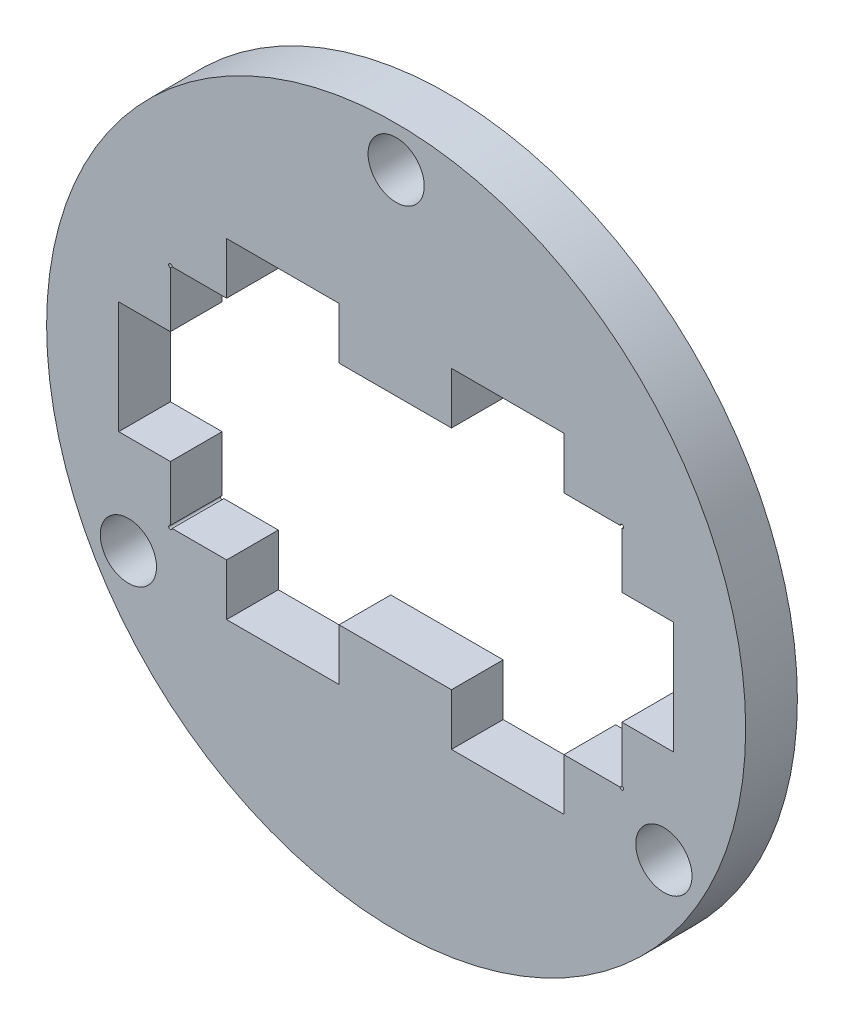
ISO-10303-21;
HEADER;
FILE_DESCRIPTION(('STEP AP214'),'2;1');
FILE_NAME('part.step','',(''),(''),'','','');
FILE_SCHEMA(('AUTOMOTIVE_DESIGN { 1 0 10303 214 1 1 1 1 }'));
ENDSEC;
DATA;
#1=APPLICATION_CONTEXT('core data for automotive mechanical design processes');
#2=APPLICATION_PROTOCOL_DEFINITION('international standard','automotive_design',2000,#1);
#3=PRODUCT_CONTEXT('',#1,'mechanical');
#4=PRODUCT('Part','Part','',(#3));
#5=PRODUCT_RELATED_PRODUCT_CATEGORY('part','',(#4));
#6=PRODUCT_DEFINITION_FORMATION('','',#4);
#7=PRODUCT_DEFINITION_CONTEXT('part definition',#1,'design');
#8=PRODUCT_DEFINITION('design','',#6,#7);
#9=PRODUCT_DEFINITION_SHAPE('','',#8);
#10=(LENGTH_UNIT() NAMED_UNIT(*) SI_UNIT(.MILLI.,.METRE.));
#11=(NAMED_UNIT(*) PLANE_ANGLE_UNIT() SI_UNIT($,.RADIAN.));
#12=(NAMED_UNIT(*) SI_UNIT($,.STERADIAN.) SOLID_ANGLE_UNIT());
#13=UNCERTAINTY_MEASURE_WITH_UNIT(LENGTH_MEASURE(1.E-05),#10,'distance_accuracy_value','');
#14=(GEOMETRIC_REPRESENTATION_CONTEXT(3) GLOBAL_UNCERTAINTY_ASSIGNED_CONTEXT((#13)) GLOBAL_UNIT_ASSIGNED_CONTEXT((#10,
#11,#12)) REPRESENTATION_CONTEXT('',''));
#15=CARTESIAN_POINT('',(0.,0.,0.));
#16=DIRECTION('',(0.,0.,1.));
#17=DIRECTION('',(1.,0.,0.));
#18=AXIS2_PLACEMENT_3D('',#15,#16,#17);
#19=CARTESIAN_POINT('',(-25.5,0.,5.842));
#20=DIRECTION('',(-1.,0.,0.));
#21=DIRECTION('',(0.,0.,1.));
#22=AXIS2_PLACEMENT_3D('',#19,#20,#21);
#23=PLANE('',#22);
#24=DIRECTION('',(0.,1.,0.));
#25=VECTOR('',#24,1.);
#26=CARTESIAN_POINT('',(-25.5,0.,0.));
#27=LINE('',#26,#25);
#28=CARTESIAN_POINT('',(-25.5,-12.6015625,0.));
#29=VERTEX_POINT('',#28);
#30=CARTESIAN_POINT('',(-25.5,-6.34999999999999,0.));
#31=VERTEX_POINT('',#30);
#32=EDGE_CURVE('E456',#29,#31,#27,.T.);
#33=ORIENTED_EDGE('',*,*,#32,.T.);
#34=DIRECTION('',(0.,0.,-1.));
#35=VECTOR('',#34,1.);
#36=CARTESIAN_POINT('',(-25.5,-6.34999999999999,5.842));
#37=LINE('',#36,#35);
#38=CARTESIAN_POINT('',(-25.5,-6.34999999999999,5.842));
#39=VERTEX_POINT('',#38);
#40=EDGE_CURVE('E276',#39,#31,#37,.T.);
#41=ORIENTED_EDGE('',*,*,#40,.F.);
#42=DIRECTION('',(0.,1.,0.));
#43=VECTOR('',#42,1.);
#44=CARTESIAN_POINT('',(-25.5,0.,5.842));
#45=LINE('',#44,#43);
#46=CARTESIAN_POINT('',(-25.5,-12.6015625,5.842));
#47=VERTEX_POINT('',#46);
#48=EDGE_CURVE('E418',#47,#39,#45,.T.);
#49=ORIENTED_EDGE('',*,*,#48,.F.);
#50=DIRECTION('',(0.,0.,-1.));
#51=VECTOR('',#50,1.);
#52=CARTESIAN_POINT('',(-25.5,-12.6015625,5.842));
#53=LINE('',#52,#51);
#54=EDGE_CURVE('E11',#47,#29,#53,.T.);
#55=ORIENTED_EDGE('',*,*,#54,.T.);
#56=EDGE_LOOP('',(#33,#41,#49,#55));
#57=FACE_BOUND('',#56,.T.);
#58=ADVANCED_FACE('F37',(#57),#23,.F.);
#59=CARTESIAN_POINT('',(25.5,0.,5.842));
#60=DIRECTION('',(-1.,0.,0.));
#61=DIRECTION('',(0.,0.,1.));
#62=AXIS2_PLACEMENT_3D('',#59,#60,#61);
#63=PLANE('',#62);
#64=DIRECTION('',(0.,0.,-1.));
#65=VECTOR('',#64,1.);
#66=CARTESIAN_POINT('',(25.5,-6.35,5.842));
#67=LINE('',#66,#65);
#68=CARTESIAN_POINT('',(25.5,-6.35,5.842));
#69=VERTEX_POINT('',#68);
#70=CARTESIAN_POINT('',(25.5,-6.35,0.));
#71=VERTEX_POINT('',#70);
#72=EDGE_CURVE('E294',#69,#71,#67,.T.);
#73=ORIENTED_EDGE('',*,*,#72,.T.);
#74=DIRECTION('',(0.,1.,0.));
#75=VECTOR('',#74,1.);
#76=CARTESIAN_POINT('',(25.5,0.,0.));
#77=LINE('',#76,#75);
#78=CARTESIAN_POINT('',(25.5,-12.6015625,0.));
#79=VERTEX_POINT('',#78);
#80=EDGE_CURVE('E471',#79,#71,#77,.T.);
#81=ORIENTED_EDGE('',*,*,#80,.F.);
#82=DIRECTION('',(0.,0.,-1.));
#83=VECTOR('',#82,1.);
#84=CARTESIAN_POINT('',(25.5,-12.6015625,5.842));
#85=LINE('',#84,#83);
#86=CARTESIAN_POINT('',(25.5,-12.6015625,5.842));
#87=VERTEX_POINT('',#86);
#88=EDGE_CURVE('E494',#87,#79,#85,.T.);
#89=ORIENTED_EDGE('',*,*,#88,.F.);
#90=DIRECTION('',(0.,1.,0.));
#91=VECTOR('',#90,1.);
#92=CARTESIAN_POINT('',(25.5,0.,5.842));
#93=LINE('',#92,#91);
#94=EDGE_CURVE('E432',#87,#69,#93,.T.);
#95=ORIENTED_EDGE('',*,*,#94,.T.);
#96=EDGE_LOOP('',(#73,#81,#89,#95));
#97=FACE_BOUND('',#96,.T.);
#98=ADVANCED_FACE('F531',(#97),#63,.T.);
#99=CARTESIAN_POINT('',(0.,-12.8,5.842));
#100=DIRECTION('',(0.,1.,0.));
#101=DIRECTION('',(0.,0.,1.));
#102=AXIS2_PLACEMENT_3D('',#99,#100,#101);
#103=PLANE('',#102);
#104=DIRECTION('',(0.,0.,-1.));
#105=VECTOR('',#104,1.);
#106=CARTESIAN_POINT('',(18.9499969420604,-12.8,5.842));
#107=LINE('',#106,#105);
#108=CARTESIAN_POINT('',(18.9499969420604,-12.8,5.842));
#109=VERTEX_POINT('',#108);
#110=CARTESIAN_POINT('',(18.9499969420604,-12.8,0.));
#111=VERTEX_POINT('',#110);
#112=EDGE_CURVE('E320',#109,#111,#107,.T.);
#113=ORIENTED_EDGE('',*,*,#112,.F.);
#114=DIRECTION('',(1.,0.,0.));
#115=VECTOR('',#114,1.);
#116=CARTESIAN_POINT('',(0.,-12.8,5.842));
#117=LINE('',#116,#115);
#118=CARTESIAN_POINT('',(25.3015625,-12.8,5.842));
#119=VERTEX_POINT('',#118);
#120=EDGE_CURVE('E438',#109,#119,#117,.T.);
#121=ORIENTED_EDGE('',*,*,#120,.T.);
#122=DIRECTION('',(0.,0.,-1.));
#123=VECTOR('',#122,1.);
#124=CARTESIAN_POINT('',(25.3015625,-12.8,5.842));
#125=LINE('',#124,#123);
#126=CARTESIAN_POINT('',(25.3015625,-12.8,0.));
#127=VERTEX_POINT('',#126);
#128=EDGE_CURVE('E491',#119,#127,#125,.T.);
#129=ORIENTED_EDGE('',*,*,#128,.T.);
#130=DIRECTION('',(1.,0.,0.));
#131=VECTOR('',#130,1.);
#132=CARTESIAN_POINT('',(0.,-12.8,0.));
#133=LINE('',#132,#131);
#134=EDGE_CURVE('E477',#111,#127,#133,.T.);
#135=ORIENTED_EDGE('',*,*,#134,.F.);
#136=EDGE_LOOP('',(#113,#121,#129,#135));
#137=FACE_BOUND('',#136,.T.);
#138=ADVANCED_FACE('F536',(#137),#103,.T.);
#139=CARTESIAN_POINT('',(0.,12.8,5.842));
#140=DIRECTION('',(0.,1.,0.));
#141=DIRECTION('',(0.,0.,1.));
#142=AXIS2_PLACEMENT_3D('',#139,#140,#141);
#143=PLANE('',#142);
#144=DIRECTION('',(1.,0.,0.));
#145=VECTOR('',#144,1.);
#146=CARTESIAN_POINT('',(0.,12.8,0.));
#147=LINE('',#146,#145);
#148=CARTESIAN_POINT('',(-6.45000305793958,12.8,0.));
#149=VERTEX_POINT('',#148);
#150=CARTESIAN_POINT('',(6.24999694206041,12.8,0.));
#151=VERTEX_POINT('',#150);
#152=EDGE_CURVE('E467',#149,#151,#147,.T.);
#153=ORIENTED_EDGE('',*,*,#152,.T.);
#154=DIRECTION('',(0.,0.,-1.));
#155=VECTOR('',#154,1.);
#156=CARTESIAN_POINT('',(6.24999694206041,12.8,5.842));
#157=LINE('',#156,#155);
#158=CARTESIAN_POINT('',(6.24999694206041,12.8,5.842));
#159=VERTEX_POINT('',#158);
#160=EDGE_CURVE('E346',#159,#151,#157,.T.);
#161=ORIENTED_EDGE('',*,*,#160,.F.);
#162=DIRECTION('',(1.,0.,0.));
#163=VECTOR('',#162,1.);
#164=CARTESIAN_POINT('',(0.,12.8,5.842));
#165=LINE('',#164,#163);
#166=CARTESIAN_POINT('',(-6.45000305793958,12.8,5.842));
#167=VERTEX_POINT('',#166);
#168=EDGE_CURVE('E428',#167,#159,#165,.T.);
#169=ORIENTED_EDGE('',*,*,#168,.F.);
#170=DIRECTION('',(0.,0.,-1.));
#171=VECTOR('',#170,1.);
#172=CARTESIAN_POINT('',(-6.45000305793958,12.8,5.842));
#173=LINE('',#172,#171);
#174=EDGE_CURVE('E401',#167,#149,#173,.T.);
#175=ORIENTED_EDGE('',*,*,#174,.T.);
#176=EDGE_LOOP('',(#153,#161,#169,#175));
#177=FACE_BOUND('',#176,.T.);
#178=ADVANCED_FACE('F609',(#177),#143,.F.);
#179=DIRECTION('',(0.,0.,-1.));
#180=VECTOR('',#179,1.);
#181=CARTESIAN_POINT('',(-19.1500030579396,-12.8,5.842));
#182=LINE('',#181,#180);
#183=CARTESIAN_POINT('',(-19.1500030579396,-12.8,5.842));
#184=VERTEX_POINT('',#183);
#185=CARTESIAN_POINT('',(-19.1500030579396,-12.8,0.));
#186=VERTEX_POINT('',#185);
#187=EDGE_CURVE('E365',#184,#186,#182,.T.);
#188=ORIENTED_EDGE('',*,*,#187,.T.);
#189=CARTESIAN_POINT('',(-25.3015625,-12.8,0.));
#190=VERTEX_POINT('',#189);
#191=EDGE_CURVE('E478',#190,#186,#133,.T.);
#192=ORIENTED_EDGE('',*,*,#191,.F.);
#193=DIRECTION('',(0.,0.,-1.));
#194=VECTOR('',#193,1.);
#195=CARTESIAN_POINT('',(-25.3015625,-12.8,5.842));
#196=LINE('',#195,#194);
#197=CARTESIAN_POINT('',(-25.3015625,-12.8,5.842));
#198=VERTEX_POINT('',#197);
#199=EDGE_CURVE('E452',#198,#190,#196,.T.);
#200=ORIENTED_EDGE('',*,*,#199,.F.);
#201=EDGE_CURVE('E439',#198,#184,#117,.T.);
#202=ORIENTED_EDGE('',*,*,#201,.T.);
#203=EDGE_LOOP('',(#188,#192,#200,#202));
#204=FACE_BOUND('',#203,.T.);
#205=ADVANCED_FACE('F549',(#204),#103,.T.);
#206=CARTESIAN_POINT('',(-25.3015625,12.8,0.));
#207=VERTEX_POINT('',#206);
#208=CARTESIAN_POINT('',(-19.1500030579396,12.8,0.));
#209=VERTEX_POINT('',#208);
#210=EDGE_CURVE('E463',#207,#209,#147,.T.);
#211=ORIENTED_EDGE('',*,*,#210,.T.);
#212=DIRECTION('',(0.,0.,-1.));
#213=VECTOR('',#212,1.);
#214=CARTESIAN_POINT('',(-19.1500030579396,12.8,5.842));
#215=LINE('',#214,#213);
#216=CARTESIAN_POINT('',(-19.1500030579396,12.8,5.842));
#217=VERTEX_POINT('',#216);
#218=EDGE_CURVE('E398',#217,#209,#215,.T.);
#219=ORIENTED_EDGE('',*,*,#218,.F.);
#220=CARTESIAN_POINT('',(-25.3015625,12.8,5.842));
#221=VERTEX_POINT('',#220);
#222=EDGE_CURVE('E424',#221,#217,#165,.T.);
#223=ORIENTED_EDGE('',*,*,#222,.F.);
#224=DIRECTION('',(0.,0.,-1.));
#225=VECTOR('',#224,1.);
#226=CARTESIAN_POINT('',(-25.3015625,12.8,5.842));
#227=LINE('',#226,#225);
#228=EDGE_CURVE('E502',#221,#207,#227,.T.);
#229=ORIENTED_EDGE('',*,*,#228,.T.);
#230=EDGE_LOOP('',(#211,#219,#223,#229));
#231=FACE_BOUND('',#230,.T.);
#232=ADVANCED_FACE('F519',(#231),#143,.F.);
#233=CARTESIAN_POINT('',(0.,0.,5.842));
#234=DIRECTION('',(0.,0.,1.));
#235=DIRECTION('',(1.,0.,0.));
#236=AXIS2_PLACEMENT_3D('',#233,#234,#235);
#237=PLANE('',#236);
#238=DIRECTION('',(-1.,0.,0.));
#239=VECTOR('',#238,1.);
#240=CARTESIAN_POINT('',(-31.342,-6.34999999999999,5.842));
#241=LINE('',#240,#239);
#242=CARTESIAN_POINT('',(-31.342,-6.34999999999999,5.842));
#243=VERTEX_POINT('',#242);
#244=EDGE_CURVE('E254',#39,#243,#241,.T.);
#245=ORIENTED_EDGE('',*,*,#244,.T.);
#246=DIRECTION('',(0.,1.,0.));
#247=VECTOR('',#246,1.);
#248=CARTESIAN_POINT('',(-31.342,-6.34999999999999,5.842));
#249=LINE('',#248,#247);
#250=CARTESIAN_POINT('',(-31.342,6.35,5.842));
#251=VERTEX_POINT('',#250);
#252=EDGE_CURVE('E249',#243,#251,#249,.T.);
#253=ORIENTED_EDGE('',*,*,#252,.T.);
#254=DIRECTION('',(1.,0.,0.));
#255=VECTOR('',#254,1.);
#256=CARTESIAN_POINT('',(-31.342,6.35,5.842));
#257=LINE('',#256,#255);
#258=CARTESIAN_POINT('',(-25.5,6.35,5.842));
#259=VERTEX_POINT('',#258);
#260=EDGE_CURVE('E257',#251,#259,#257,.T.);
#261=ORIENTED_EDGE('',*,*,#260,.T.);
#262=CARTESIAN_POINT('',(-25.5,12.6015625,5.842));
#263=VERTEX_POINT('',#262);
#264=EDGE_CURVE('E416',#259,#263,#45,.T.);
#265=ORIENTED_EDGE('',*,*,#264,.T.);
#266=CARTESIAN_POINT('',(-25.5,12.8,5.842));
#267=DIRECTION('',(0.,0.,1.));
#268=DIRECTION('',(1.,0.,0.));
#269=AXIS2_PLACEMENT_3D('',#266,#267,#268);
#270=CIRCLE('',#269,0.198437499999999);
#271=EDGE_CURVE('E420',#221,#263,#270,.T.);
#272=ORIENTED_EDGE('',*,*,#271,.F.);
#273=ORIENTED_EDGE('',*,*,#222,.T.);
#274=DIRECTION('',(0.,1.,0.));
#275=VECTOR('',#274,1.);
#276=CARTESIAN_POINT('',(-19.1500030579396,12.8,5.842));
#277=LINE('',#276,#275);
#278=CARTESIAN_POINT('',(-19.1500030579396,18.642,5.842));
#279=VERTEX_POINT('',#278);
#280=EDGE_CURVE('E381',#217,#279,#277,.T.);
#281=ORIENTED_EDGE('',*,*,#280,.T.);
#282=DIRECTION('',(1.,0.,0.));
#283=VECTOR('',#282,1.);
#284=CARTESIAN_POINT('',(-19.1500030579396,18.642,5.842));
#285=LINE('',#284,#283);
#286=CARTESIAN_POINT('',(-6.45000305793958,18.642,5.842));
#287=VERTEX_POINT('',#286);
#288=EDGE_CURVE('E384',#279,#287,#285,.T.);
#289=ORIENTED_EDGE('',*,*,#288,.T.);
#290=DIRECTION('',(0.,-1.,0.));
#291=VECTOR('',#290,1.);
#292=CARTESIAN_POINT('',(-6.45000305793958,12.8,5.842));
#293=LINE('',#292,#291);
#294=EDGE_CURVE('E388',#287,#167,#293,.T.);
#295=ORIENTED_EDGE('',*,*,#294,.T.);
#296=ORIENTED_EDGE('',*,*,#168,.T.);
#297=DIRECTION('',(0.,1.,0.));
#298=VECTOR('',#297,1.);
#299=CARTESIAN_POINT('',(6.24999694206041,12.8,5.842));
#300=LINE('',#299,#298);
#301=CARTESIAN_POINT('',(6.24999694206041,18.642,5.842));
#302=VERTEX_POINT('',#301);
#303=EDGE_CURVE('E329',#159,#302,#300,.T.);
#304=ORIENTED_EDGE('',*,*,#303,.T.);
#305=DIRECTION('',(1.,0.,0.));
#306=VECTOR('',#305,1.);
#307=CARTESIAN_POINT('',(18.9499969420604,18.642,5.842));
#308=LINE('',#307,#306);
#309=CARTESIAN_POINT('',(18.9499969420604,18.642,5.842));
#310=VERTEX_POINT('',#309);
#311=EDGE_CURVE('E332',#302,#310,#308,.T.);
#312=ORIENTED_EDGE('',*,*,#311,.T.);
#313=DIRECTION('',(0.,-1.,0.));
#314=VECTOR('',#313,1.);
#315=CARTESIAN_POINT('',(18.9499969420604,12.8,5.842));
#316=LINE('',#315,#314);
#317=CARTESIAN_POINT('',(18.9499969420604,12.8,5.842));
#318=VERTEX_POINT('',#317);
#319=EDGE_CURVE('E336',#310,#318,#316,.T.);
#320=ORIENTED_EDGE('',*,*,#319,.T.);
#321=CARTESIAN_POINT('',(25.3015625,12.8,5.842));
#322=VERTEX_POINT('',#321);
#323=EDGE_CURVE('E423',#318,#322,#165,.T.);
#324=ORIENTED_EDGE('',*,*,#323,.T.);
#325=CARTESIAN_POINT('',(25.5,12.8,5.842));
#326=DIRECTION('',(0.,0.,1.));
#327=DIRECTION('',(1.,0.,0.));
#328=AXIS2_PLACEMENT_3D('',#325,#326,#327);
#329=CIRCLE('',#328,0.198437499999999);
#330=CARTESIAN_POINT('',(25.5,12.6015625,5.842));
#331=VERTEX_POINT('',#330);
#332=EDGE_CURVE('E427',#331,#322,#329,.T.);
#333=ORIENTED_EDGE('',*,*,#332,.F.);
#334=CARTESIAN_POINT('',(25.5,6.35,5.842));
#335=VERTEX_POINT('',#334);
#336=EDGE_CURVE('E431',#335,#331,#93,.T.);
#337=ORIENTED_EDGE('',*,*,#336,.F.);
#338=DIRECTION('',(1.,0.,0.));
#339=VECTOR('',#338,1.);
#340=CARTESIAN_POINT('',(31.342,6.35,5.842));
#341=LINE('',#340,#339);
#342=CARTESIAN_POINT('',(31.342,6.35,5.842));
#343=VERTEX_POINT('',#342);
#344=EDGE_CURVE('E60',#335,#343,#341,.T.);
#345=ORIENTED_EDGE('',*,*,#344,.T.);
#346=DIRECTION('',(0.,-1.,0.));
#347=VECTOR('',#346,1.);
#348=CARTESIAN_POINT('',(31.342,-6.35,5.842));
#349=LINE('',#348,#347);
#350=CARTESIAN_POINT('',(31.342,-6.35,5.842));
#351=VERTEX_POINT('',#350);
#352=EDGE_CURVE('E280',#343,#351,#349,.T.);
#353=ORIENTED_EDGE('',*,*,#352,.T.);
#354=DIRECTION('',(-1.,0.,0.));
#355=VECTOR('',#354,1.);
#356=CARTESIAN_POINT('',(31.342,-6.35,5.842));
#357=LINE('',#356,#355);
#358=EDGE_CURVE('E284',#351,#69,#357,.T.);
#359=ORIENTED_EDGE('',*,*,#358,.T.);
#360=ORIENTED_EDGE('',*,*,#94,.F.);
#361=CARTESIAN_POINT('',(25.5,-12.8,5.842));
#362=DIRECTION('',(0.,0.,1.));
#363=DIRECTION('',(1.,0.,0.));
#364=AXIS2_PLACEMENT_3D('',#361,#362,#363);
#365=CIRCLE('',#364,0.198437499999999);
#366=EDGE_CURVE('E435',#119,#87,#365,.T.);
#367=ORIENTED_EDGE('',*,*,#366,.F.);
#368=ORIENTED_EDGE('',*,*,#120,.F.);
#369=DIRECTION('',(0.,-1.,0.));
#370=VECTOR('',#369,1.);
#371=CARTESIAN_POINT('',(18.9499969420604,-12.8,5.842));
#372=LINE('',#371,#370);
#373=CARTESIAN_POINT('',(18.9499969420604,-18.642,5.842));
#374=VERTEX_POINT('',#373);
#375=EDGE_CURVE('E303',#109,#374,#372,.T.);
#376=ORIENTED_EDGE('',*,*,#375,.T.);
#377=DIRECTION('',(-1.,0.,0.));
#378=VECTOR('',#377,1.);
#379=CARTESIAN_POINT('',(18.9499969420604,-18.642,5.842));
#380=LINE('',#379,#378);
#381=CARTESIAN_POINT('',(6.24999694206041,-18.642,5.842));
#382=VERTEX_POINT('',#381);
#383=EDGE_CURVE('E306',#374,#382,#380,.T.);
#384=ORIENTED_EDGE('',*,*,#383,.T.);
#385=DIRECTION('',(0.,1.,0.));
#386=VECTOR('',#385,1.);
#387=CARTESIAN_POINT('',(6.24999694206041,-12.8,5.842));
#388=LINE('',#387,#386);
#389=CARTESIAN_POINT('',(6.24999694206041,-12.8,5.842));
#390=VERTEX_POINT('',#389);
#391=EDGE_CURVE('E310',#382,#390,#388,.T.);
#392=ORIENTED_EDGE('',*,*,#391,.T.);
#393=CARTESIAN_POINT('',(-6.45000305793958,-12.8,5.842));
#394=VERTEX_POINT('',#393);
#395=EDGE_CURVE('E443',#394,#390,#117,.T.);
#396=ORIENTED_EDGE('',*,*,#395,.F.);
#397=DIRECTION('',(0.,-1.,0.));
#398=VECTOR('',#397,1.);
#399=CARTESIAN_POINT('',(-6.45000305793958,-12.8,5.842));
#400=LINE('',#399,#398);
#401=CARTESIAN_POINT('',(-6.45000305793958,-18.642,5.842));
#402=VERTEX_POINT('',#401);
#403=EDGE_CURVE('E358',#394,#402,#400,.T.);
#404=ORIENTED_EDGE('',*,*,#403,.T.);
#405=DIRECTION('',(-1.,0.,0.));
#406=VECTOR('',#405,1.);
#407=CARTESIAN_POINT('',(-19.1500030579396,-18.642,5.842));
#408=LINE('',#407,#406);
#409=CARTESIAN_POINT('',(-19.1500030579396,-18.642,5.842));
#410=VERTEX_POINT('',#409);
#411=EDGE_CURVE('E362',#402,#410,#408,.T.);
#412=ORIENTED_EDGE('',*,*,#411,.T.);
#413=DIRECTION('',(0.,1.,0.));
#414=VECTOR('',#413,1.);
#415=CARTESIAN_POINT('',(-19.1500030579396,-12.8,5.842));
#416=LINE('',#415,#414);
#417=EDGE_CURVE('E355',#410,#184,#416,.T.);
#418=ORIENTED_EDGE('',*,*,#417,.T.);
#419=ORIENTED_EDGE('',*,*,#201,.F.);
#420=CARTESIAN_POINT('',(-25.5,-12.8,5.842));
#421=DIRECTION('',(0.,0.,1.));
#422=DIRECTION('',(1.,0.,0.));
#423=AXIS2_PLACEMENT_3D('',#420,#421,#422);
#424=CIRCLE('',#423,0.198437499999999);
#425=EDGE_CURVE('E413',#47,#198,#424,.T.);
#426=ORIENTED_EDGE('',*,*,#425,.F.);
#427=ORIENTED_EDGE('',*,*,#48,.T.);
#428=EDGE_LOOP('',(#245,#253,#261,#265,#272,#273,#281,#289,#295,#296,#304,#312,#320,#324,#333,
#337,#345,#353,#359,#360,#367,#368,#376,#384,#392,#396,#404,#412,#418,#419,#426,#427));
#429=FACE_BOUND('',#428,.T.);
#430=CARTESIAN_POINT('',(30.2459372271715,-17.4625,5.842));
#431=DIRECTION('',(0.,0.,1.));
#432=DIRECTION('',(1.,0.,0.));
#433=AXIS2_PLACEMENT_3D('',#430,#431,#432);
#434=CIRCLE('',#433,3.175);
#435=CARTESIAN_POINT('',(33.4209372271715,-17.4625,5.842));
#436=VERTEX_POINT('',#435);
#437=EDGE_CURVE('E449',#436,#436,#434,.T.);
#438=ORIENTED_EDGE('',*,*,#437,.F.);
#439=EDGE_LOOP('',(#438));
#440=FACE_BOUND('',#439,.T.);
#441=CARTESIAN_POINT('',(0.,34.925,5.842));
#442=DIRECTION('',(0.,0.,1.));
#443=DIRECTION('',(1.,0.,0.));
#444=AXIS2_PLACEMENT_3D('',#441,#442,#443);
#445=CIRCLE('',#444,3.175);
#446=CARTESIAN_POINT('',(3.17499999999999,34.925,5.842));
#447=VERTEX_POINT('',#446);
#448=EDGE_CURVE('E446',#447,#447,#445,.T.);
#449=ORIENTED_EDGE('',*,*,#448,.F.);
#450=EDGE_LOOP('',(#449));
#451=FACE_BOUND('',#450,.T.);
#452=CARTESIAN_POINT('',(-30.2459372271715,-17.4625,5.842));
#453=DIRECTION('',(0.,0.,1.));
#454=DIRECTION('',(1.,0.,0.));
#455=AXIS2_PLACEMENT_3D('',#452,#453,#454);
#456=CIRCLE('',#455,3.175);
#457=CARTESIAN_POINT('',(-27.0709372271715,-17.4625,5.842));
#458=VERTEX_POINT('',#457);
#459=EDGE_CURVE('E442',#458,#458,#456,.T.);
#460=ORIENTED_EDGE('',*,*,#459,.F.);
#461=EDGE_LOOP('',(#460));
#462=FACE_BOUND('',#461,.T.);
#463=CARTESIAN_POINT('',(0.,0.,5.842));
#464=DIRECTION('',(0.,0.,-1.));
#465=DIRECTION('',(-1.,0.,0.));
#466=AXIS2_PLACEMENT_3D('',#463,#464,#465);
#467=CIRCLE('',#466,39.487499946);
#468=CARTESIAN_POINT('',(-39.487499946,0.,5.842));
#469=VERTEX_POINT('',#468);
#470=EDGE_CURVE('E407',#469,#469,#467,.T.);
#471=ORIENTED_EDGE('',*,*,#470,.F.);
#472=EDGE_LOOP('',(#471));
#473=FACE_BOUND('',#472,.T.);
#474=ADVANCED_FACE('F262',(#429,#440,#451,#462,#473),#237,.T.);
#475=CARTESIAN_POINT('',(0.,0.,0.));
#476=DIRECTION('',(0.,0.,1.));
#477=DIRECTION('',(1.,0.,0.));
#478=AXIS2_PLACEMENT_3D('',#475,#476,#477);
#479=PLANE('',#478);
#480=CARTESIAN_POINT('',(30.2459372271715,-17.4625,0.));
#481=DIRECTION('',(0.,0.,1.));
#482=DIRECTION('',(1.,0.,0.));
#483=AXIS2_PLACEMENT_3D('',#480,#481,#482);
#484=CIRCLE('',#483,3.175);
#485=CARTESIAN_POINT('',(33.4209372271715,-17.4625,0.));
#486=VERTEX_POINT('',#485);
#487=EDGE_CURVE('E417',#486,#486,#484,.T.);
#488=ORIENTED_EDGE('',*,*,#487,.T.);
#489=EDGE_LOOP('',(#488));
#490=FACE_BOUND('',#489,.T.);
#491=CARTESIAN_POINT('',(0.,34.925,0.));
#492=DIRECTION('',(0.,0.,1.));
#493=DIRECTION('',(1.,0.,0.));
#494=AXIS2_PLACEMENT_3D('',#491,#492,#493);
#495=CIRCLE('',#494,3.175);
#496=CARTESIAN_POINT('',(3.17499999999999,34.925,0.));
#497=VERTEX_POINT('',#496);
#498=EDGE_CURVE('E485',#497,#497,#495,.T.);
#499=ORIENTED_EDGE('',*,*,#498,.T.);
#500=EDGE_LOOP('',(#499));
#501=FACE_BOUND('',#500,.T.);
#502=CARTESIAN_POINT('',(-30.2459372271715,-17.4625,0.));
#503=DIRECTION('',(0.,0.,1.));
#504=DIRECTION('',(1.,0.,0.));
#505=AXIS2_PLACEMENT_3D('',#502,#503,#504);
#506=CIRCLE('',#505,3.175);
#507=CARTESIAN_POINT('',(-27.0709372271715,-17.4625,0.));
#508=VERTEX_POINT('',#507);
#509=EDGE_CURVE('E481',#508,#508,#506,.T.);
#510=ORIENTED_EDGE('',*,*,#509,.T.);
#511=EDGE_LOOP('',(#510));
#512=FACE_BOUND('',#511,.T.);
#513=DIRECTION('',(0.,1.,0.));
#514=VECTOR('',#513,1.);
#515=CARTESIAN_POINT('',(-31.342,-6.34999999999999,0.));
#516=LINE('',#515,#514);
#517=CARTESIAN_POINT('',(-31.342,-6.34999999999999,0.));
#518=VERTEX_POINT('',#517);
#519=CARTESIAN_POINT('',(-31.342,6.35,0.));
#520=VERTEX_POINT('',#519);
#521=EDGE_CURVE('E252',#518,#520,#516,.T.);
#522=ORIENTED_EDGE('',*,*,#521,.F.);
#523=DIRECTION('',(-1.,0.,0.));
#524=VECTOR('',#523,1.);
#525=CARTESIAN_POINT('',(-31.342,-6.34999999999999,0.));
#526=LINE('',#525,#524);
#527=EDGE_CURVE('E265',#31,#518,#526,.T.);
#528=ORIENTED_EDGE('',*,*,#527,.F.);
#529=ORIENTED_EDGE('',*,*,#32,.F.);
#530=CARTESIAN_POINT('',(-25.5,-12.8,0.));
#531=DIRECTION('',(0.,0.,1.));
#532=DIRECTION('',(1.,0.,0.));
#533=AXIS2_PLACEMENT_3D('',#530,#531,#532);
#534=CIRCLE('',#533,0.198437499999999);
#535=EDGE_CURVE('E410',#29,#190,#534,.T.);
#536=ORIENTED_EDGE('',*,*,#535,.T.);
#537=ORIENTED_EDGE('',*,*,#191,.T.);
#538=DIRECTION('',(0.,1.,0.));
#539=VECTOR('',#538,1.);
#540=CARTESIAN_POINT('',(-19.1500030579396,-12.8,0.));
#541=LINE('',#540,#539);
#542=CARTESIAN_POINT('',(-19.1500030579396,-18.642,0.));
#543=VERTEX_POINT('',#542);
#544=EDGE_CURVE('E348',#543,#186,#541,.T.);
#545=ORIENTED_EDGE('',*,*,#544,.F.);
#546=DIRECTION('',(-1.,0.,0.));
#547=VECTOR('',#546,1.);
#548=CARTESIAN_POINT('',(-19.1500030579396,-18.642,0.));
#549=LINE('',#548,#547);
#550=CARTESIAN_POINT('',(-6.45000305793958,-18.642,0.));
#551=VERTEX_POINT('',#550);
#552=EDGE_CURVE('E359',#551,#543,#549,.T.);
#553=ORIENTED_EDGE('',*,*,#552,.F.);
#554=DIRECTION('',(0.,-1.,0.));
#555=VECTOR('',#554,1.);
#556=CARTESIAN_POINT('',(-6.45000305793958,-12.8,0.));
#557=LINE('',#556,#555);
#558=CARTESIAN_POINT('',(-6.45000305793958,-12.8,0.));
#559=VERTEX_POINT('',#558);
#560=EDGE_CURVE('E367',#559,#551,#557,.T.);
#561=ORIENTED_EDGE('',*,*,#560,.F.);
#562=CARTESIAN_POINT('',(6.24999694206041,-12.8,0.));
#563=VERTEX_POINT('',#562);
#564=EDGE_CURVE('E482',#559,#563,#133,.T.);
#565=ORIENTED_EDGE('',*,*,#564,.T.);
#566=DIRECTION('',(0.,1.,0.));
#567=VECTOR('',#566,1.);
#568=CARTESIAN_POINT('',(6.24999694206041,-12.8,0.));
#569=LINE('',#568,#567);
#570=CARTESIAN_POINT('',(6.24999694206041,-18.642,0.));
#571=VERTEX_POINT('',#570);
#572=EDGE_CURVE('E307',#571,#563,#569,.T.);
#573=ORIENTED_EDGE('',*,*,#572,.F.);
#574=DIRECTION('',(-1.,0.,0.));
#575=VECTOR('',#574,1.);
#576=CARTESIAN_POINT('',(18.9499969420604,-18.642,0.));
#577=LINE('',#576,#575);
#578=CARTESIAN_POINT('',(18.9499969420604,-18.642,0.));
#579=VERTEX_POINT('',#578);
#580=EDGE_CURVE('E316',#579,#571,#577,.T.);
#581=ORIENTED_EDGE('',*,*,#580,.F.);
#582=DIRECTION('',(0.,-1.,0.));
#583=VECTOR('',#582,1.);
#584=CARTESIAN_POINT('',(18.9499969420604,-12.8,0.));
#585=LINE('',#584,#583);
#586=EDGE_CURVE('E297',#111,#579,#585,.T.);
#587=ORIENTED_EDGE('',*,*,#586,.F.);
#588=ORIENTED_EDGE('',*,*,#134,.T.);
#589=CARTESIAN_POINT('',(25.5,-12.8,0.));
#590=DIRECTION('',(0.,0.,1.));
#591=DIRECTION('',(1.,0.,0.));
#592=AXIS2_PLACEMENT_3D('',#589,#590,#591);
#593=CIRCLE('',#592,0.198437499999999);
#594=EDGE_CURVE('E474',#127,#79,#593,.T.);
#595=ORIENTED_EDGE('',*,*,#594,.T.);
#596=ORIENTED_EDGE('',*,*,#80,.T.);
#597=DIRECTION('',(-1.,0.,0.));
#598=VECTOR('',#597,1.);
#599=CARTESIAN_POINT('',(31.342,-6.35,0.));
#600=LINE('',#599,#598);
#601=CARTESIAN_POINT('',(31.342,-6.35,0.));
#602=VERTEX_POINT('',#601);
#603=EDGE_CURVE('E281',#602,#71,#600,.T.);
#604=ORIENTED_EDGE('',*,*,#603,.F.);
#605=DIRECTION('',(0.,-1.,0.));
#606=VECTOR('',#605,1.);
#607=CARTESIAN_POINT('',(31.342,-6.35,0.));
#608=LINE('',#607,#606);
#609=CARTESIAN_POINT('',(31.342,6.35,0.));
#610=VERTEX_POINT('',#609);
#611=EDGE_CURVE('E290',#610,#602,#608,.T.);
#612=ORIENTED_EDGE('',*,*,#611,.F.);
#613=DIRECTION('',(1.,0.,0.));
#614=VECTOR('',#613,1.);
#615=CARTESIAN_POINT('',(31.342,6.35,0.));
#616=LINE('',#615,#614);
#617=CARTESIAN_POINT('',(25.5,6.35,0.));
#618=VERTEX_POINT('',#617);
#619=EDGE_CURVE('E275',#618,#610,#616,.T.);
#620=ORIENTED_EDGE('',*,*,#619,.F.);
#621=CARTESIAN_POINT('',(25.5,12.6015625,0.));
#622=VERTEX_POINT('',#621);
#623=EDGE_CURVE('E470',#618,#622,#77,.T.);
#624=ORIENTED_EDGE('',*,*,#623,.T.);
#625=CARTESIAN_POINT('',(25.5,12.8,0.));
#626=DIRECTION('',(0.,0.,1.));
#627=DIRECTION('',(1.,0.,0.));
#628=AXIS2_PLACEMENT_3D('',#625,#626,#627);
#629=CIRCLE('',#628,0.198437499999999);
#630=CARTESIAN_POINT('',(25.3015625,12.8,0.));
#631=VERTEX_POINT('',#630);
#632=EDGE_CURVE('E466',#622,#631,#629,.T.);
#633=ORIENTED_EDGE('',*,*,#632,.T.);
#634=CARTESIAN_POINT('',(18.9499969420604,12.8,0.));
#635=VERTEX_POINT('',#634);
#636=EDGE_CURVE('E462',#635,#631,#147,.T.);
#637=ORIENTED_EDGE('',*,*,#636,.F.);
#638=DIRECTION('',(0.,-1.,0.));
#639=VECTOR('',#638,1.);
#640=CARTESIAN_POINT('',(18.9499969420604,12.8,0.));
#641=LINE('',#640,#639);
#642=CARTESIAN_POINT('',(18.9499969420604,18.642,0.));
#643=VERTEX_POINT('',#642);
#644=EDGE_CURVE('E333',#643,#635,#641,.T.);
#645=ORIENTED_EDGE('',*,*,#644,.F.);
#646=DIRECTION('',(1.,0.,0.));
#647=VECTOR('',#646,1.);
#648=CARTESIAN_POINT('',(18.9499969420604,18.642,0.));
#649=LINE('',#648,#647);
#650=CARTESIAN_POINT('',(6.24999694206041,18.642,0.));
#651=VERTEX_POINT('',#650);
#652=EDGE_CURVE('E342',#651,#643,#649,.T.);
#653=ORIENTED_EDGE('',*,*,#652,.F.);
#654=DIRECTION('',(0.,1.,0.));
#655=VECTOR('',#654,1.);
#656=CARTESIAN_POINT('',(6.24999694206041,12.8,0.));
#657=LINE('',#656,#655);
#658=EDGE_CURVE('E322',#151,#651,#657,.T.);
#659=ORIENTED_EDGE('',*,*,#658,.F.);
#660=ORIENTED_EDGE('',*,*,#152,.F.);
#661=DIRECTION('',(0.,-1.,0.));
#662=VECTOR('',#661,1.);
#663=CARTESIAN_POINT('',(-6.45000305793958,12.8,0.));
#664=LINE('',#663,#662);
#665=CARTESIAN_POINT('',(-6.45000305793958,18.642,0.));
#666=VERTEX_POINT('',#665);
#667=EDGE_CURVE('E385',#666,#149,#664,.T.);
#668=ORIENTED_EDGE('',*,*,#667,.F.);
#669=DIRECTION('',(1.,0.,0.));
#670=VECTOR('',#669,1.);
#671=CARTESIAN_POINT('',(-19.1500030579396,18.642,0.));
#672=LINE('',#671,#670);
#673=CARTESIAN_POINT('',(-19.1500030579396,18.642,0.));
#674=VERTEX_POINT('',#673);
#675=EDGE_CURVE('E394',#674,#666,#672,.T.);
#676=ORIENTED_EDGE('',*,*,#675,.F.);
#677=DIRECTION('',(0.,1.,0.));
#678=VECTOR('',#677,1.);
#679=CARTESIAN_POINT('',(-19.1500030579396,12.8,0.));
#680=LINE('',#679,#678);
#681=EDGE_CURVE('E374',#209,#674,#680,.T.);
#682=ORIENTED_EDGE('',*,*,#681,.F.);
#683=ORIENTED_EDGE('',*,*,#210,.F.);
#684=CARTESIAN_POINT('',(-25.5,12.8,0.));
#685=DIRECTION('',(0.,0.,1.));
#686=DIRECTION('',(1.,0.,0.));
#687=AXIS2_PLACEMENT_3D('',#684,#685,#686);
#688=CIRCLE('',#687,0.198437499999999);
#689=CARTESIAN_POINT('',(-25.5,12.6015625,0.));
#690=VERTEX_POINT('',#689);
#691=EDGE_CURVE('E459',#207,#690,#688,.T.);
#692=ORIENTED_EDGE('',*,*,#691,.T.);
#693=CARTESIAN_POINT('',(-25.5,6.35,0.));
#694=VERTEX_POINT('',#693);
#695=EDGE_CURVE('E455',#694,#690,#27,.T.);
#696=ORIENTED_EDGE('',*,*,#695,.F.);
#697=DIRECTION('',(1.,0.,0.));
#698=VECTOR('',#697,1.);
#699=CARTESIAN_POINT('',(-31.342,6.35,0.));
#700=LINE('',#699,#698);
#701=EDGE_CURVE('E52',#520,#694,#700,.T.);
#702=ORIENTED_EDGE('',*,*,#701,.F.);
#703=EDGE_LOOP('',(#522,#528,#529,#536,#537,#545,#553,#561,#565,#573,#581,#587,#588,#595,#596,
#604,#612,#620,#624,#633,#637,#645,#653,#659,#660,#668,#676,#682,#683,#692,#696,#702));
#704=FACE_BOUND('',#703,.T.);
#705=CARTESIAN_POINT('',(0.,0.,0.));
#706=DIRECTION('',(0.,0.,-1.));
#707=DIRECTION('',(-1.,0.,0.));
#708=AXIS2_PLACEMENT_3D('',#705,#706,#707);
#709=CIRCLE('',#708,39.487499946);
#710=CARTESIAN_POINT('',(-39.487499946,0.,0.));
#711=VERTEX_POINT('',#710);
#712=EDGE_CURVE('E400',#711,#711,#709,.T.);
#713=ORIENTED_EDGE('',*,*,#712,.T.);
#714=EDGE_LOOP('',(#713));
#715=FACE_BOUND('',#714,.T.);
#716=ADVANCED_FACE('F513',(#490,#501,#512,#704,#715),#479,.F.);
#717=CARTESIAN_POINT('',(-25.5,-12.8,5.842));
#718=DIRECTION('',(0.,0.,-1.));
#719=DIRECTION('',(-1.,0.,0.));
#720=AXIS2_PLACEMENT_3D('',#717,#718,#719);
#721=CYLINDRICAL_SURFACE('',#720,0.198437499999999);
#722=ORIENTED_EDGE('',*,*,#535,.F.);
#723=ORIENTED_EDGE('',*,*,#54,.F.);
#724=ORIENTED_EDGE('',*,*,#425,.T.);
#725=ORIENTED_EDGE('',*,*,#199,.T.);
#726=EDGE_LOOP('',(#722,#723,#724,#725));
#727=FACE_BOUND('',#726,.T.);
#728=ADVANCED_FACE('F39',(#727),#721,.F.);
#729=ORIENTED_EDGE('',*,*,#264,.F.);
#730=DIRECTION('',(0.,0.,-1.));
#731=VECTOR('',#730,1.);
#732=CARTESIAN_POINT('',(-25.5,6.35,5.842));
#733=LINE('',#732,#731);
#734=EDGE_CURVE('E253',#259,#694,#733,.T.);
#735=ORIENTED_EDGE('',*,*,#734,.T.);
#736=ORIENTED_EDGE('',*,*,#695,.T.);
#737=DIRECTION('',(0.,0.,-1.));
#738=VECTOR('',#737,1.);
#739=CARTESIAN_POINT('',(-25.5,12.6015625,5.842));
#740=LINE('',#739,#738);
#741=EDGE_CURVE('E45',#263,#690,#740,.T.);
#742=ORIENTED_EDGE('',*,*,#741,.F.);
#743=EDGE_LOOP('',(#729,#735,#736,#742));
#744=FACE_BOUND('',#743,.T.);
#745=ADVANCED_FACE('F521',(#744),#23,.F.);
#746=CARTESIAN_POINT('',(-25.5,12.8,5.842));
#747=DIRECTION('',(0.,0.,-1.));
#748=DIRECTION('',(-1.,0.,0.));
#749=AXIS2_PLACEMENT_3D('',#746,#747,#748);
#750=CYLINDRICAL_SURFACE('',#749,0.198437499999999);
#751=ORIENTED_EDGE('',*,*,#691,.F.);
#752=ORIENTED_EDGE('',*,*,#228,.F.);
#753=ORIENTED_EDGE('',*,*,#271,.T.);
#754=ORIENTED_EDGE('',*,*,#741,.T.);
#755=EDGE_LOOP('',(#751,#752,#753,#754));
#756=FACE_BOUND('',#755,.T.);
#757=ADVANCED_FACE('F507',(#756),#750,.F.);
#758=ORIENTED_EDGE('',*,*,#323,.F.);
#759=DIRECTION('',(0.,0.,-1.));
#760=VECTOR('',#759,1.);
#761=CARTESIAN_POINT('',(18.9499969420604,12.8,5.842));
#762=LINE('',#761,#760);
#763=EDGE_CURVE('E349',#318,#635,#762,.T.);
#764=ORIENTED_EDGE('',*,*,#763,.T.);
#765=ORIENTED_EDGE('',*,*,#636,.T.);
#766=DIRECTION('',(0.,0.,-1.));
#767=VECTOR('',#766,1.);
#768=CARTESIAN_POINT('',(25.3015625,12.8,5.842));
#769=LINE('',#768,#767);
#770=EDGE_CURVE('E499',#322,#631,#769,.T.);
#771=ORIENTED_EDGE('',*,*,#770,.F.);
#772=EDGE_LOOP('',(#758,#764,#765,#771));
#773=FACE_BOUND('',#772,.T.);
#774=ADVANCED_FACE('F527',(#773),#143,.F.);
#775=CARTESIAN_POINT('',(25.5,12.8,5.842));
#776=DIRECTION('',(0.,0.,-1.));
#777=DIRECTION('',(-1.,0.,0.));
#778=AXIS2_PLACEMENT_3D('',#775,#776,#777);
#779=CYLINDRICAL_SURFACE('',#778,0.198437499999999);
#780=ORIENTED_EDGE('',*,*,#632,.F.);
#781=DIRECTION('',(0.,0.,-1.));
#782=VECTOR('',#781,1.);
#783=CARTESIAN_POINT('',(25.5,12.6015625,5.842));
#784=LINE('',#783,#782);
#785=EDGE_CURVE('E496',#331,#622,#784,.T.);
#786=ORIENTED_EDGE('',*,*,#785,.F.);
#787=ORIENTED_EDGE('',*,*,#332,.T.);
#788=ORIENTED_EDGE('',*,*,#770,.T.);
#789=EDGE_LOOP('',(#780,#786,#787,#788));
#790=FACE_BOUND('',#789,.T.);
#791=ADVANCED_FACE('F599',(#790),#779,.F.);
#792=DIRECTION('',(0.,0.,-1.));
#793=VECTOR('',#792,1.);
#794=CARTESIAN_POINT('',(25.5,6.35,5.842));
#795=LINE('',#794,#793);
#796=EDGE_CURVE('E287',#335,#618,#795,.T.);
#797=ORIENTED_EDGE('',*,*,#796,.F.);
#798=ORIENTED_EDGE('',*,*,#336,.T.);
#799=ORIENTED_EDGE('',*,*,#785,.T.);
#800=ORIENTED_EDGE('',*,*,#623,.F.);
#801=EDGE_LOOP('',(#797,#798,#799,#800));
#802=FACE_BOUND('',#801,.T.);
#803=ADVANCED_FACE('F539',(#802),#63,.T.);
#804=CARTESIAN_POINT('',(25.5,-12.8,5.842));
#805=DIRECTION('',(0.,0.,-1.));
#806=DIRECTION('',(-1.,0.,0.));
#807=AXIS2_PLACEMENT_3D('',#804,#805,#806);
#808=CYLINDRICAL_SURFACE('',#807,0.198437499999999);
#809=ORIENTED_EDGE('',*,*,#594,.F.);
#810=ORIENTED_EDGE('',*,*,#128,.F.);
#811=ORIENTED_EDGE('',*,*,#366,.T.);
#812=ORIENTED_EDGE('',*,*,#88,.T.);
#813=EDGE_LOOP('',(#809,#810,#811,#812));
#814=FACE_BOUND('',#813,.T.);
#815=ADVANCED_FACE('F579',(#814),#808,.F.);
#816=CARTESIAN_POINT('',(30.2459372271715,-17.4625,5.842));
#817=DIRECTION('',(0.,0.,-1.));
#818=DIRECTION('',(-1.,0.,0.));
#819=AXIS2_PLACEMENT_3D('',#816,#817,#818);
#820=CYLINDRICAL_SURFACE('',#819,3.175);
#821=ORIENTED_EDGE('',*,*,#437,.T.);
#822=EDGE_LOOP('',(#821));
#823=FACE_BOUND('',#822,.T.);
#824=ORIENTED_EDGE('',*,*,#487,.F.);
#825=EDGE_LOOP('',(#824));
#826=FACE_BOUND('',#825,.T.);
#827=ADVANCED_FACE('F873',(#823,#826),#820,.F.);
#828=CARTESIAN_POINT('',(0.,34.925,5.842));
#829=DIRECTION('',(0.,0.,-1.));
#830=DIRECTION('',(-1.,0.,0.));
#831=AXIS2_PLACEMENT_3D('',#828,#829,#830);
#832=CYLINDRICAL_SURFACE('',#831,3.175);
#833=ORIENTED_EDGE('',*,*,#448,.T.);
#834=EDGE_LOOP('',(#833));
#835=FACE_BOUND('',#834,.T.);
#836=ORIENTED_EDGE('',*,*,#498,.F.);
#837=EDGE_LOOP('',(#836));
#838=FACE_BOUND('',#837,.T.);
#839=ADVANCED_FACE('F876',(#835,#838),#832,.F.);
#840=CARTESIAN_POINT('',(-30.2459372271715,-17.4625,5.842));
#841=DIRECTION('',(0.,0.,-1.));
#842=DIRECTION('',(-1.,0.,0.));
#843=AXIS2_PLACEMENT_3D('',#840,#841,#842);
#844=CYLINDRICAL_SURFACE('',#843,3.175);
#845=ORIENTED_EDGE('',*,*,#459,.T.);
#846=EDGE_LOOP('',(#845));
#847=FACE_BOUND('',#846,.T.);
#848=ORIENTED_EDGE('',*,*,#509,.F.);
#849=EDGE_LOOP('',(#848));
#850=FACE_BOUND('',#849,.T.);
#851=ADVANCED_FACE('F640',(#847,#850),#844,.F.);
#852=DIRECTION('',(0.,0.,-1.));
#853=VECTOR('',#852,1.);
#854=CARTESIAN_POINT('',(6.24999694206041,-12.8,5.842));
#855=LINE('',#854,#853);
#856=EDGE_CURVE('E323',#390,#563,#855,.T.);
#857=ORIENTED_EDGE('',*,*,#856,.T.);
#858=ORIENTED_EDGE('',*,*,#564,.F.);
#859=DIRECTION('',(0.,0.,-1.));
#860=VECTOR('',#859,1.);
#861=CARTESIAN_POINT('',(-6.45000305793958,-12.8,5.842));
#862=LINE('',#861,#860);
#863=EDGE_CURVE('E377',#394,#559,#862,.T.);
#864=ORIENTED_EDGE('',*,*,#863,.F.);
#865=ORIENTED_EDGE('',*,*,#395,.T.);
#866=EDGE_LOOP('',(#857,#858,#864,#865));
#867=FACE_BOUND('',#866,.T.);
#868=ADVANCED_FACE('F566',(#867),#103,.T.);
#869=CARTESIAN_POINT('',(0.,0.,5.842));
#870=DIRECTION('',(0.,0.,-1.));
#871=DIRECTION('',(-1.,0.,0.));
#872=AXIS2_PLACEMENT_3D('',#869,#870,#871);
#873=CYLINDRICAL_SURFACE('',#872,39.487499946);
#874=ORIENTED_EDGE('',*,*,#470,.T.);
#875=EDGE_LOOP('',(#874));
#876=FACE_BOUND('',#875,.T.);
#877=ORIENTED_EDGE('',*,*,#712,.F.);
#878=EDGE_LOOP('',(#877));
#879=FACE_BOUND('',#878,.T.);
#880=ADVANCED_FACE('F639',(#876,#879),#873,.T.);
#881=CARTESIAN_POINT('',(-19.1500030579396,12.8,5.842));
#882=DIRECTION('',(-1.,0.,0.));
#883=DIRECTION('',(0.,0.,1.));
#884=AXIS2_PLACEMENT_3D('',#881,#882,#883);
#885=PLANE('',#884);
#886=ORIENTED_EDGE('',*,*,#681,.T.);
#887=DIRECTION('',(0.,0.,-1.));
#888=VECTOR('',#887,1.);
#889=CARTESIAN_POINT('',(-19.1500030579396,18.642,5.842));
#890=LINE('',#889,#888);
#891=EDGE_CURVE('E391',#279,#674,#890,.T.);
#892=ORIENTED_EDGE('',*,*,#891,.F.);
#893=ORIENTED_EDGE('',*,*,#280,.F.);
#894=ORIENTED_EDGE('',*,*,#218,.T.);
#895=EDGE_LOOP('',(#886,#892,#893,#894));
#896=FACE_BOUND('',#895,.T.);
#897=ADVANCED_FACE('F708',(#896),#885,.F.);
#898=CARTESIAN_POINT('',(-6.45000305793958,12.8,5.842));
#899=DIRECTION('',(1.,0.,0.));
#900=DIRECTION('',(0.,1.,0.));
#901=AXIS2_PLACEMENT_3D('',#898,#899,#900);
#902=PLANE('',#901);
#903=ORIENTED_EDGE('',*,*,#667,.T.);
#904=ORIENTED_EDGE('',*,*,#174,.F.);
#905=ORIENTED_EDGE('',*,*,#294,.F.);
#906=DIRECTION('',(0.,0.,-1.));
#907=VECTOR('',#906,1.);
#908=CARTESIAN_POINT('',(-6.45000305793958,18.642,5.842));
#909=LINE('',#908,#907);
#910=EDGE_CURVE('E404',#287,#666,#909,.T.);
#911=ORIENTED_EDGE('',*,*,#910,.T.);
#912=EDGE_LOOP('',(#903,#904,#905,#911));
#913=FACE_BOUND('',#912,.T.);
#914=ADVANCED_FACE('F713',(#913),#902,.F.);
#915=CARTESIAN_POINT('',(-19.1500030579396,18.642,5.842));
#916=DIRECTION('',(0.,1.,0.));
#917=DIRECTION('',(-1.,0.,0.));
#918=AXIS2_PLACEMENT_3D('',#915,#916,#917);
#919=PLANE('',#918);
#920=ORIENTED_EDGE('',*,*,#675,.T.);
#921=ORIENTED_EDGE('',*,*,#910,.F.);
#922=ORIENTED_EDGE('',*,*,#288,.F.);
#923=ORIENTED_EDGE('',*,*,#891,.T.);
#924=EDGE_LOOP('',(#920,#921,#922,#923));
#925=FACE_BOUND('',#924,.T.);
#926=ADVANCED_FACE('F724',(#925),#919,.F.);
#927=CARTESIAN_POINT('',(-19.1500030579396,-12.8,5.842));
#928=DIRECTION('',(-1.,0.,0.));
#929=DIRECTION('',(0.,0.,1.));
#930=AXIS2_PLACEMENT_3D('',#927,#928,#929);
#931=PLANE('',#930);
#932=ORIENTED_EDGE('',*,*,#544,.T.);
#933=ORIENTED_EDGE('',*,*,#187,.F.);
#934=ORIENTED_EDGE('',*,*,#417,.F.);
#935=DIRECTION('',(0.,0.,-1.));
#936=VECTOR('',#935,1.);
#937=CARTESIAN_POINT('',(-19.1500030579396,-18.642,5.842));
#938=LINE('',#937,#936);
#939=EDGE_CURVE('E372',#410,#543,#938,.T.);
#940=ORIENTED_EDGE('',*,*,#939,.T.);
#941=EDGE_LOOP('',(#932,#933,#934,#940));
#942=FACE_BOUND('',#941,.T.);
#943=ADVANCED_FACE('F554',(#942),#931,.F.);
#944=CARTESIAN_POINT('',(-19.1500030579396,-18.642,5.842));
#945=DIRECTION('',(0.,-1.,0.));
#946=DIRECTION('',(1.,0.,0.));
#947=AXIS2_PLACEMENT_3D('',#944,#945,#946);
#948=PLANE('',#947);
#949=ORIENTED_EDGE('',*,*,#552,.T.);
#950=ORIENTED_EDGE('',*,*,#939,.F.);
#951=ORIENTED_EDGE('',*,*,#411,.F.);
#952=DIRECTION('',(0.,0.,-1.));
#953=VECTOR('',#952,1.);
#954=CARTESIAN_POINT('',(-6.45000305793958,-18.642,5.842));
#955=LINE('',#954,#953);
#956=EDGE_CURVE('E375',#402,#551,#955,.T.);
#957=ORIENTED_EDGE('',*,*,#956,.T.);
#958=EDGE_LOOP('',(#949,#950,#951,#957));
#959=FACE_BOUND('',#958,.T.);
#960=ADVANCED_FACE('F558',(#959),#948,.F.);
#961=CARTESIAN_POINT('',(-6.45000305793958,-12.8,5.842));
#962=DIRECTION('',(1.,0.,0.));
#963=DIRECTION('',(0.,1.,0.));
#964=AXIS2_PLACEMENT_3D('',#961,#962,#963);
#965=PLANE('',#964);
#966=ORIENTED_EDGE('',*,*,#560,.T.);
#967=ORIENTED_EDGE('',*,*,#956,.F.);
#968=ORIENTED_EDGE('',*,*,#403,.F.);
#969=ORIENTED_EDGE('',*,*,#863,.T.);
#970=EDGE_LOOP('',(#966,#967,#968,#969));
#971=FACE_BOUND('',#970,.T.);
#972=ADVANCED_FACE('F560',(#971),#965,.F.);
#973=CARTESIAN_POINT('',(6.24999694206041,12.8,5.842));
#974=DIRECTION('',(-1.,0.,0.));
#975=DIRECTION('',(0.,0.,1.));
#976=AXIS2_PLACEMENT_3D('',#973,#974,#975);
#977=PLANE('',#976);
#978=ORIENTED_EDGE('',*,*,#658,.T.);
#979=DIRECTION('',(0.,0.,-1.));
#980=VECTOR('',#979,1.);
#981=CARTESIAN_POINT('',(6.24999694206041,18.642,5.842));
#982=LINE('',#981,#980);
#983=EDGE_CURVE('E339',#302,#651,#982,.T.);
#984=ORIENTED_EDGE('',*,*,#983,.F.);
#985=ORIENTED_EDGE('',*,*,#303,.F.);
#986=ORIENTED_EDGE('',*,*,#160,.T.);
#987=EDGE_LOOP('',(#978,#984,#985,#986));
#988=FACE_BOUND('',#987,.T.);
#989=ADVANCED_FACE('F615',(#988),#977,.F.);
#990=CARTESIAN_POINT('',(18.9499969420604,12.8,5.842));
#991=DIRECTION('',(1.,0.,0.));
#992=DIRECTION('',(0.,0.,-1.));
#993=AXIS2_PLACEMENT_3D('',#990,#991,#992);
#994=PLANE('',#993);
#995=ORIENTED_EDGE('',*,*,#644,.T.);
#996=ORIENTED_EDGE('',*,*,#763,.F.);
#997=ORIENTED_EDGE('',*,*,#319,.F.);
#998=DIRECTION('',(0.,0.,-1.));
#999=VECTOR('',#998,1.);
#1000=CARTESIAN_POINT('',(18.9499969420604,18.642,5.842));
#1001=LINE('',#1000,#999);
#1002=EDGE_CURVE('E352',#310,#643,#1001,.T.);
#1003=ORIENTED_EDGE('',*,*,#1002,.T.);
#1004=EDGE_LOOP('',(#995,#996,#997,#1003));
#1005=FACE_BOUND('',#1004,.T.);
#1006=ADVANCED_FACE('F767',(#1005),#994,.F.);
#1007=CARTESIAN_POINT('',(18.9499969420604,18.642,5.842));
#1008=DIRECTION('',(0.,1.,0.));
#1009=DIRECTION('',(0.,0.,1.));
#1010=AXIS2_PLACEMENT_3D('',#1007,#1008,#1009);
#1011=PLANE('',#1010);
#1012=ORIENTED_EDGE('',*,*,#652,.T.);
#1013=ORIENTED_EDGE('',*,*,#1002,.F.);
#1014=ORIENTED_EDGE('',*,*,#311,.F.);
#1015=ORIENTED_EDGE('',*,*,#983,.T.);
#1016=EDGE_LOOP('',(#1012,#1013,#1014,#1015));
#1017=FACE_BOUND('',#1016,.T.);
#1018=ADVANCED_FACE('F776',(#1017),#1011,.F.);
#1019=CARTESIAN_POINT('',(18.9499969420604,-12.8,5.842));
#1020=DIRECTION('',(1.,0.,0.));
#1021=DIRECTION('',(0.,0.,-1.));
#1022=AXIS2_PLACEMENT_3D('',#1019,#1020,#1021);
#1023=PLANE('',#1022);
#1024=ORIENTED_EDGE('',*,*,#586,.T.);
#1025=DIRECTION('',(0.,0.,-1.));
#1026=VECTOR('',#1025,1.);
#1027=CARTESIAN_POINT('',(18.9499969420604,-18.642,5.842));
#1028=LINE('',#1027,#1026);
#1029=EDGE_CURVE('E313',#374,#579,#1028,.T.);
#1030=ORIENTED_EDGE('',*,*,#1029,.F.);
#1031=ORIENTED_EDGE('',*,*,#375,.F.);
#1032=ORIENTED_EDGE('',*,*,#112,.T.);
#1033=EDGE_LOOP('',(#1024,#1030,#1031,#1032));
#1034=FACE_BOUND('',#1033,.T.);
#1035=ADVANCED_FACE('F786',(#1034),#1023,.F.);
#1036=CARTESIAN_POINT('',(6.24999694206041,-12.8,5.842));
#1037=DIRECTION('',(-1.,0.,0.));
#1038=DIRECTION('',(0.,0.,1.));
#1039=AXIS2_PLACEMENT_3D('',#1036,#1037,#1038);
#1040=PLANE('',#1039);
#1041=ORIENTED_EDGE('',*,*,#572,.T.);
#1042=ORIENTED_EDGE('',*,*,#856,.F.);
#1043=ORIENTED_EDGE('',*,*,#391,.F.);
#1044=DIRECTION('',(0.,0.,-1.));
#1045=VECTOR('',#1044,1.);
#1046=CARTESIAN_POINT('',(6.24999694206041,-18.642,5.842));
#1047=LINE('',#1046,#1045);
#1048=EDGE_CURVE('E326',#382,#571,#1047,.T.);
#1049=ORIENTED_EDGE('',*,*,#1048,.T.);
#1050=EDGE_LOOP('',(#1041,#1042,#1043,#1049));
#1051=FACE_BOUND('',#1050,.T.);
#1052=ADVANCED_FACE('F796',(#1051),#1040,.F.);
#1053=CARTESIAN_POINT('',(18.9499969420604,-18.642,5.842));
#1054=DIRECTION('',(0.,-1.,0.));
#1055=DIRECTION('',(0.,0.,-1.));
#1056=AXIS2_PLACEMENT_3D('',#1053,#1054,#1055);
#1057=PLANE('',#1056);
#1058=ORIENTED_EDGE('',*,*,#580,.T.);
#1059=ORIENTED_EDGE('',*,*,#1048,.F.);
#1060=ORIENTED_EDGE('',*,*,#383,.F.);
#1061=ORIENTED_EDGE('',*,*,#1029,.T.);
#1062=EDGE_LOOP('',(#1058,#1059,#1060,#1061));
#1063=FACE_BOUND('',#1062,.T.);
#1064=ADVANCED_FACE('F806',(#1063),#1057,.F.);
#1065=CARTESIAN_POINT('',(31.342,-6.35,5.842));
#1066=DIRECTION('',(0.,-1.,0.));
#1067=DIRECTION('',(0.,0.,-1.));
#1068=AXIS2_PLACEMENT_3D('',#1065,#1066,#1067);
#1069=PLANE('',#1068);
#1070=ORIENTED_EDGE('',*,*,#603,.T.);
#1071=ORIENTED_EDGE('',*,*,#72,.F.);
#1072=ORIENTED_EDGE('',*,*,#358,.F.);
#1073=DIRECTION('',(0.,0.,-1.));
#1074=VECTOR('',#1073,1.);
#1075=CARTESIAN_POINT('',(31.342,-6.35,5.842));
#1076=LINE('',#1075,#1074);
#1077=EDGE_CURVE('E298',#351,#602,#1076,.T.);
#1078=ORIENTED_EDGE('',*,*,#1077,.T.);
#1079=EDGE_LOOP('',(#1070,#1071,#1072,#1078));
#1080=FACE_BOUND('',#1079,.T.);
#1081=ADVANCED_FACE('F586',(#1080),#1069,.F.);
#1082=CARTESIAN_POINT('',(31.342,-6.35,5.842));
#1083=DIRECTION('',(1.,0.,0.));
#1084=DIRECTION('',(0.,0.,-1.));
#1085=AXIS2_PLACEMENT_3D('',#1082,#1083,#1084);
#1086=PLANE('',#1085);
#1087=ORIENTED_EDGE('',*,*,#611,.T.);
#1088=ORIENTED_EDGE('',*,*,#1077,.F.);
#1089=ORIENTED_EDGE('',*,*,#352,.F.);
#1090=DIRECTION('',(0.,0.,-1.));
#1091=VECTOR('',#1090,1.);
#1092=CARTESIAN_POINT('',(31.342,6.35,5.842));
#1093=LINE('',#1092,#1091);
#1094=EDGE_CURVE('E300',#343,#610,#1093,.T.);
#1095=ORIENTED_EDGE('',*,*,#1094,.T.);
#1096=EDGE_LOOP('',(#1087,#1088,#1089,#1095));
#1097=FACE_BOUND('',#1096,.T.);
#1098=ADVANCED_FACE('F590',(#1097),#1086,.F.);
#1099=CARTESIAN_POINT('',(31.342,6.35,5.842));
#1100=DIRECTION('',(0.,1.,0.));
#1101=DIRECTION('',(0.,0.,1.));
#1102=AXIS2_PLACEMENT_3D('',#1099,#1100,#1101);
#1103=PLANE('',#1102);
#1104=ORIENTED_EDGE('',*,*,#619,.T.);
#1105=ORIENTED_EDGE('',*,*,#1094,.F.);
#1106=ORIENTED_EDGE('',*,*,#344,.F.);
#1107=ORIENTED_EDGE('',*,*,#796,.T.);
#1108=EDGE_LOOP('',(#1104,#1105,#1106,#1107));
#1109=FACE_BOUND('',#1108,.T.);
#1110=ADVANCED_FACE('F591',(#1109),#1103,.F.);
#1111=CARTESIAN_POINT('',(-31.342,-6.34999999999999,5.842));
#1112=DIRECTION('',(-1.,0.,0.));
#1113=DIRECTION('',(0.,0.,1.));
#1114=AXIS2_PLACEMENT_3D('',#1111,#1112,#1113);
#1115=PLANE('',#1114);
#1116=ORIENTED_EDGE('',*,*,#521,.T.);
#1117=DIRECTION('',(0.,0.,-1.));
#1118=VECTOR('',#1117,1.);
#1119=CARTESIAN_POINT('',(-31.342,6.35,5.842));
#1120=LINE('',#1119,#1118);
#1121=EDGE_CURVE('E245',#251,#520,#1120,.T.);
#1122=ORIENTED_EDGE('',*,*,#1121,.F.);
#1123=ORIENTED_EDGE('',*,*,#252,.F.);
#1124=DIRECTION('',(0.,0.,-1.));
#1125=VECTOR('',#1124,1.);
#1126=CARTESIAN_POINT('',(-31.342,-6.34999999999999,5.842));
#1127=LINE('',#1126,#1125);
#1128=EDGE_CURVE('E273',#243,#518,#1127,.T.);
#1129=ORIENTED_EDGE('',*,*,#1128,.T.);
#1130=EDGE_LOOP('',(#1116,#1122,#1123,#1129));
#1131=FACE_BOUND('',#1130,.T.);
#1132=ADVANCED_FACE('F247',(#1131),#1115,.F.);
#1133=CARTESIAN_POINT('',(-31.342,-6.34999999999999,5.842));
#1134=DIRECTION('',(0.,-1.,0.));
#1135=DIRECTION('',(0.,0.,-1.));
#1136=AXIS2_PLACEMENT_3D('',#1133,#1134,#1135);
#1137=PLANE('',#1136);
#1138=ORIENTED_EDGE('',*,*,#527,.T.);
#1139=ORIENTED_EDGE('',*,*,#1128,.F.);
#1140=ORIENTED_EDGE('',*,*,#244,.F.);
#1141=ORIENTED_EDGE('',*,*,#40,.T.);
#1142=EDGE_LOOP('',(#1138,#1139,#1140,#1141));
#1143=FACE_BOUND('',#1142,.T.);
#1144=ADVANCED_FACE('F849',(#1143),#1137,.F.);
#1145=CARTESIAN_POINT('',(-31.342,6.35,5.842));
#1146=DIRECTION('',(0.,1.,0.));
#1147=DIRECTION('',(0.,0.,1.));
#1148=AXIS2_PLACEMENT_3D('',#1145,#1146,#1147);
#1149=PLANE('',#1148);
#1150=ORIENTED_EDGE('',*,*,#701,.T.);
#1151=ORIENTED_EDGE('',*,*,#734,.F.);
#1152=ORIENTED_EDGE('',*,*,#260,.F.);
#1153=ORIENTED_EDGE('',*,*,#1121,.T.);
#1154=EDGE_LOOP('',(#1150,#1151,#1152,#1153));
#1155=FACE_BOUND('',#1154,.T.);
#1156=ADVANCED_FACE('F258',(#1155),#1149,.F.);
#1157=CLOSED_SHELL('',(#58,#98,#138,#178,#205,#232,#474,#716,#728,#745,#757,#774,#791,#803,#815,
#827,#839,#851,#868,#880,#897,#914,#926,#943,#960,#972,#989,#1006,#1018,#1035,#1052,#1064,#1081,
#1098,#1110,#1132,#1144,#1156));
#1158=MANIFOLD_SOLID_BREP('B2',#1157);
#1159=ADVANCED_BREP_SHAPE_REPRESENTATION('',(#18,#1158),#14);
#1160=SHAPE_DEFINITION_REPRESENTATION(#9,#1159);
ENDSEC;
END-ISO-10303-21;
